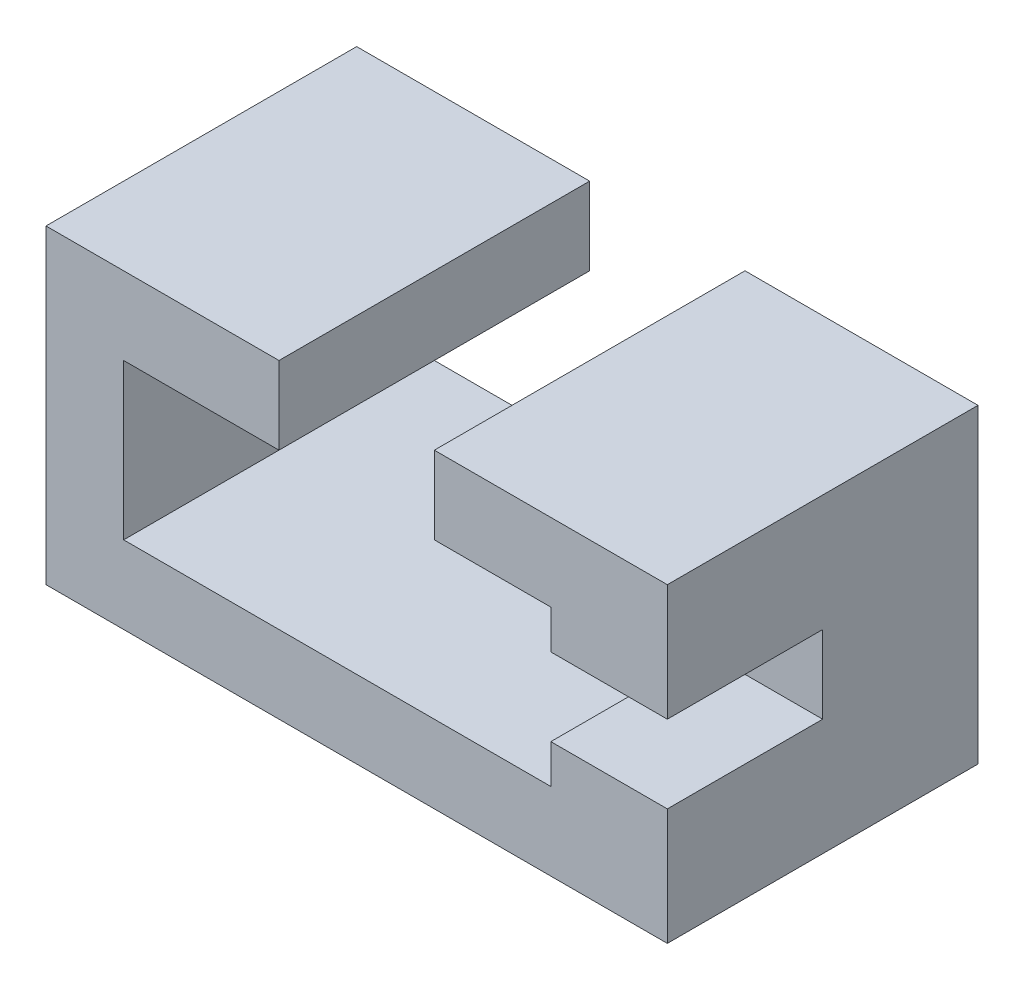
ISO-10303-21;
HEADER;
FILE_DESCRIPTION(('STEP AP214'),'2;1');
FILE_NAME('part.step','',(''),(''),'','','');
FILE_SCHEMA(('AUTOMOTIVE_DESIGN { 1 0 10303 214 1 1 1 1 }'));
ENDSEC;
DATA;
#1=APPLICATION_CONTEXT('core data for automotive mechanical design processes');
#2=APPLICATION_PROTOCOL_DEFINITION('international standard','automotive_design',2000,#1);
#3=PRODUCT_CONTEXT('',#1,'mechanical');
#4=PRODUCT('Part','Part','',(#3));
#5=PRODUCT_RELATED_PRODUCT_CATEGORY('part','',(#4));
#6=PRODUCT_DEFINITION_FORMATION('','',#4);
#7=PRODUCT_DEFINITION_CONTEXT('part definition',#1,'design');
#8=PRODUCT_DEFINITION('design','',#6,#7);
#9=PRODUCT_DEFINITION_SHAPE('','',#8);
#10=(LENGTH_UNIT() NAMED_UNIT(*) SI_UNIT(.MILLI.,.METRE.));
#11=(NAMED_UNIT(*) PLANE_ANGLE_UNIT() SI_UNIT($,.RADIAN.));
#12=(NAMED_UNIT(*) SI_UNIT($,.STERADIAN.) SOLID_ANGLE_UNIT());
#13=UNCERTAINTY_MEASURE_WITH_UNIT(LENGTH_MEASURE(1.E-05),#10,'distance_accuracy_value','');
#14=(GEOMETRIC_REPRESENTATION_CONTEXT(3) GLOBAL_UNCERTAINTY_ASSIGNED_CONTEXT((#13)) GLOBAL_UNIT_ASSIGNED_CONTEXT((#10,
#11,#12)) REPRESENTATION_CONTEXT('',''));
#15=CARTESIAN_POINT('',(0.,0.,0.));
#16=DIRECTION('',(0.,0.,1.));
#17=DIRECTION('',(1.,0.,0.));
#18=AXIS2_PLACEMENT_3D('',#15,#16,#17);
#19=CARTESIAN_POINT('',(-40.,20.,40.));
#20=DIRECTION('',(0.,-1.,0.));
#21=DIRECTION('',(0.,0.,-1.));
#22=AXIS2_PLACEMENT_3D('',#19,#20,#21);
#23=PLANE('',#22);
#24=DIRECTION('',(-1.,0.,0.));
#25=VECTOR('',#24,1.);
#26=CARTESIAN_POINT('',(-40.,20.,40.));
#27=LINE('',#26,#25);
#28=CARTESIAN_POINT('',(-10.,20.,40.));
#29=VERTEX_POINT('',#28);
#30=CARTESIAN_POINT('',(-40.,20.,40.));
#31=VERTEX_POINT('',#30);
#32=EDGE_CURVE('E204',#29,#31,#27,.T.);
#33=ORIENTED_EDGE('',*,*,#32,.F.);
#34=DIRECTION('',(0.,0.,1.));
#35=VECTOR('',#34,1.);
#36=CARTESIAN_POINT('',(-10.,20.,0.));
#37=LINE('',#36,#35);
#38=CARTESIAN_POINT('',(-10.,20.,0.));
#39=VERTEX_POINT('',#38);
#40=EDGE_CURVE('E251',#39,#29,#37,.T.);
#41=ORIENTED_EDGE('',*,*,#40,.F.);
#42=DIRECTION('',(-1.,0.,0.));
#43=VECTOR('',#42,1.);
#44=CARTESIAN_POINT('',(-40.,20.,0.));
#45=LINE('',#44,#43);
#46=CARTESIAN_POINT('',(-40.,20.,0.));
#47=VERTEX_POINT('',#46);
#48=EDGE_CURVE('E160',#39,#47,#45,.T.);
#49=ORIENTED_EDGE('',*,*,#48,.T.);
#50=DIRECTION('',(0.,0.,-1.));
#51=VECTOR('',#50,1.);
#52=CARTESIAN_POINT('',(-40.,20.,40.));
#53=LINE('',#52,#51);
#54=EDGE_CURVE('E41',#31,#47,#53,.T.);
#55=ORIENTED_EDGE('',*,*,#54,.F.);
#56=EDGE_LOOP('',(#33,#41,#49,#55));
#57=FACE_BOUND('',#56,.T.);
#58=ADVANCED_FACE('F33',(#57),#23,.F.);
#59=CARTESIAN_POINT('',(0.,0.,40.));
#60=DIRECTION('',(0.,0.,-1.));
#61=DIRECTION('',(-1.,0.,0.));
#62=AXIS2_PLACEMENT_3D('',#59,#60,#61);
#63=PLANE('',#62);
#64=DIRECTION('',(-1.,0.,0.));
#65=VECTOR('',#64,1.);
#66=CARTESIAN_POINT('',(-30.,10.,40.));
#67=LINE('',#66,#65);
#68=CARTESIAN_POINT('',(-10.,10.,40.));
#69=VERTEX_POINT('',#68);
#70=CARTESIAN_POINT('',(-30.,10.,40.));
#71=VERTEX_POINT('',#70);
#72=EDGE_CURVE('E187',#69,#71,#67,.T.);
#73=ORIENTED_EDGE('',*,*,#72,.F.);
#74=DIRECTION('',(0.,-1.,0.));
#75=VECTOR('',#74,1.);
#76=CARTESIAN_POINT('',(-10.,20.,40.));
#77=LINE('',#76,#75);
#78=EDGE_CURVE('E56',#29,#69,#77,.T.);
#79=ORIENTED_EDGE('',*,*,#78,.F.);
#80=ORIENTED_EDGE('',*,*,#32,.T.);
#81=DIRECTION('',(0.,-1.,0.));
#82=VECTOR('',#81,1.);
#83=CARTESIAN_POINT('',(-40.,-20.,40.));
#84=LINE('',#83,#82);
#85=CARTESIAN_POINT('',(-40.,-20.,40.));
#86=VERTEX_POINT('',#85);
#87=EDGE_CURVE('E209',#31,#86,#84,.T.);
#88=ORIENTED_EDGE('',*,*,#87,.T.);
#89=DIRECTION('',(1.,0.,0.));
#90=VECTOR('',#89,1.);
#91=CARTESIAN_POINT('',(-40.,-20.,40.));
#92=LINE('',#91,#90);
#93=CARTESIAN_POINT('',(40.,-20.,40.));
#94=VERTEX_POINT('',#93);
#95=EDGE_CURVE('E211',#86,#94,#92,.T.);
#96=ORIENTED_EDGE('',*,*,#95,.T.);
#97=DIRECTION('',(0.,1.,0.));
#98=VECTOR('',#97,1.);
#99=CARTESIAN_POINT('',(40.,-20.,40.));
#100=LINE('',#99,#98);
#101=CARTESIAN_POINT('',(40.,-5.,40.));
#102=VERTEX_POINT('',#101);
#103=EDGE_CURVE('E201',#94,#102,#100,.T.);
#104=ORIENTED_EDGE('',*,*,#103,.T.);
#105=DIRECTION('',(1.,0.,0.));
#106=VECTOR('',#105,1.);
#107=CARTESIAN_POINT('',(40.,-5.,40.));
#108=LINE('',#107,#106);
#109=CARTESIAN_POINT('',(25.,-5.,40.));
#110=VERTEX_POINT('',#109);
#111=EDGE_CURVE('E250',#110,#102,#108,.T.);
#112=ORIENTED_EDGE('',*,*,#111,.F.);
#113=DIRECTION('',(0.,1.,0.));
#114=VECTOR('',#113,1.);
#115=CARTESIAN_POINT('',(25.,10.,40.));
#116=LINE('',#115,#114);
#117=CARTESIAN_POINT('',(25.,-10.,40.));
#118=VERTEX_POINT('',#117);
#119=EDGE_CURVE('E184',#118,#110,#116,.T.);
#120=ORIENTED_EDGE('',*,*,#119,.F.);
#121=DIRECTION('',(1.,0.,0.));
#122=VECTOR('',#121,1.);
#123=CARTESIAN_POINT('',(-30.,-10.,40.));
#124=LINE('',#123,#122);
#125=CARTESIAN_POINT('',(-30.,-10.,40.));
#126=VERTEX_POINT('',#125);
#127=EDGE_CURVE('E179',#126,#118,#124,.T.);
#128=ORIENTED_EDGE('',*,*,#127,.F.);
#129=DIRECTION('',(0.,-1.,0.));
#130=VECTOR('',#129,1.);
#131=CARTESIAN_POINT('',(-30.,10.,40.));
#132=LINE('',#131,#130);
#133=EDGE_CURVE('E177',#71,#126,#132,.T.);
#134=ORIENTED_EDGE('',*,*,#133,.F.);
#135=EDGE_LOOP('',(#73,#79,#80,#88,#96,#104,#112,#120,#128,#134));
#136=FACE_BOUND('',#135,.T.);
#137=ADVANCED_FACE('F248',(#136),#63,.F.);
#138=CARTESIAN_POINT('',(-30.,10.,0.));
#139=DIRECTION('',(0.,1.,0.));
#140=DIRECTION('',(0.,0.,1.));
#141=AXIS2_PLACEMENT_3D('',#138,#139,#140);
#142=PLANE('',#141);
#143=DIRECTION('',(-1.,0.,0.));
#144=VECTOR('',#143,1.);
#145=CARTESIAN_POINT('',(-30.,10.,0.));
#146=LINE('',#145,#144);
#147=CARTESIAN_POINT('',(-10.,10.,0.));
#148=VERTEX_POINT('',#147);
#149=CARTESIAN_POINT('',(-30.,10.,0.));
#150=VERTEX_POINT('',#149);
#151=EDGE_CURVE('E157',#148,#150,#146,.T.);
#152=ORIENTED_EDGE('',*,*,#151,.F.);
#153=DIRECTION('',(0.,0.,1.));
#154=VECTOR('',#153,1.);
#155=CARTESIAN_POINT('',(-10.,10.,0.));
#156=LINE('',#155,#154);
#157=EDGE_CURVE('E143',#148,#69,#156,.T.);
#158=ORIENTED_EDGE('',*,*,#157,.T.);
#159=ORIENTED_EDGE('',*,*,#72,.T.);
#160=DIRECTION('',(0.,0.,1.));
#161=VECTOR('',#160,1.);
#162=CARTESIAN_POINT('',(-30.,10.,0.));
#163=LINE('',#162,#161);
#164=EDGE_CURVE('E165',#150,#71,#163,.T.);
#165=ORIENTED_EDGE('',*,*,#164,.F.);
#166=EDGE_LOOP('',(#152,#158,#159,#165));
#167=FACE_BOUND('',#166,.T.);
#168=ADVANCED_FACE('F163',(#167),#142,.F.);
#169=CARTESIAN_POINT('',(40.,-20.,40.));
#170=DIRECTION('',(-1.,0.,0.));
#171=DIRECTION('',(0.,0.,1.));
#172=AXIS2_PLACEMENT_3D('',#169,#170,#171);
#173=PLANE('',#172);
#174=DIRECTION('',(0.,1.,0.));
#175=VECTOR('',#174,1.);
#176=CARTESIAN_POINT('',(40.,-5.,20.));
#177=LINE('',#176,#175);
#178=CARTESIAN_POINT('',(40.,-5.,20.));
#179=VERTEX_POINT('',#178);
#180=CARTESIAN_POINT('',(40.,5.,20.));
#181=VERTEX_POINT('',#180);
#182=EDGE_CURVE('E262',#179,#181,#177,.T.);
#183=ORIENTED_EDGE('',*,*,#182,.F.);
#184=DIRECTION('',(0.,0.,1.));
#185=VECTOR('',#184,1.);
#186=CARTESIAN_POINT('',(40.,-5.,20.));
#187=LINE('',#186,#185);
#188=EDGE_CURVE('E180',#179,#102,#187,.T.);
#189=ORIENTED_EDGE('',*,*,#188,.T.);
#190=ORIENTED_EDGE('',*,*,#103,.F.);
#191=DIRECTION('',(0.,0.,-1.));
#192=VECTOR('',#191,1.);
#193=CARTESIAN_POINT('',(40.,-20.,40.));
#194=LINE('',#193,#192);
#195=CARTESIAN_POINT('',(40.,-20.,0.));
#196=VERTEX_POINT('',#195);
#197=EDGE_CURVE('E213',#94,#196,#194,.T.);
#198=ORIENTED_EDGE('',*,*,#197,.T.);
#199=DIRECTION('',(0.,1.,0.));
#200=VECTOR('',#199,1.);
#201=CARTESIAN_POINT('',(40.,-20.,0.));
#202=LINE('',#201,#200);
#203=CARTESIAN_POINT('',(40.,20.,0.));
#204=VERTEX_POINT('',#203);
#205=EDGE_CURVE('E193',#196,#204,#202,.T.);
#206=ORIENTED_EDGE('',*,*,#205,.T.);
#207=DIRECTION('',(0.,0.,-1.));
#208=VECTOR('',#207,1.);
#209=CARTESIAN_POINT('',(40.,20.,40.));
#210=LINE('',#209,#208);
#211=CARTESIAN_POINT('',(40.,20.,40.));
#212=VERTEX_POINT('',#211);
#213=EDGE_CURVE('E11',#212,#204,#210,.T.);
#214=ORIENTED_EDGE('',*,*,#213,.F.);
#215=CARTESIAN_POINT('',(40.,5.,40.));
#216=VERTEX_POINT('',#215);
#217=EDGE_CURVE('E205',#216,#212,#100,.T.);
#218=ORIENTED_EDGE('',*,*,#217,.F.);
#219=DIRECTION('',(0.,0.,1.));
#220=VECTOR('',#219,1.);
#221=CARTESIAN_POINT('',(40.,5.,20.));
#222=LINE('',#221,#220);
#223=EDGE_CURVE('E271',#181,#216,#222,.T.);
#224=ORIENTED_EDGE('',*,*,#223,.F.);
#225=EDGE_LOOP('',(#183,#189,#190,#198,#206,#214,#218,#224));
#226=FACE_BOUND('',#225,.T.);
#227=ADVANCED_FACE('F35',(#226),#173,.F.);
#228=CARTESIAN_POINT('',(9.99999999999999,20.,0.));
#229=VERTEX_POINT('',#228);
#230=EDGE_CURVE('E216',#204,#229,#45,.T.);
#231=ORIENTED_EDGE('',*,*,#230,.T.);
#232=DIRECTION('',(0.,0.,1.));
#233=VECTOR('',#232,1.);
#234=CARTESIAN_POINT('',(9.99999999999999,20.,0.));
#235=LINE('',#234,#233);
#236=CARTESIAN_POINT('',(9.99999999999999,20.,40.));
#237=VERTEX_POINT('',#236);
#238=EDGE_CURVE('E253',#229,#237,#235,.T.);
#239=ORIENTED_EDGE('',*,*,#238,.T.);
#240=EDGE_CURVE('E206',#212,#237,#27,.T.);
#241=ORIENTED_EDGE('',*,*,#240,.F.);
#242=ORIENTED_EDGE('',*,*,#213,.T.);
#243=EDGE_LOOP('',(#231,#239,#241,#242));
#244=FACE_BOUND('',#243,.T.);
#245=ADVANCED_FACE('F297',(#244),#23,.F.);
#246=CARTESIAN_POINT('',(-40.,-20.,40.));
#247=DIRECTION('',(1.,0.,0.));
#248=DIRECTION('',(0.,0.,-1.));
#249=AXIS2_PLACEMENT_3D('',#246,#247,#248);
#250=PLANE('',#249);
#251=DIRECTION('',(0.,-1.,0.));
#252=VECTOR('',#251,1.);
#253=CARTESIAN_POINT('',(-40.,-20.,0.));
#254=LINE('',#253,#252);
#255=CARTESIAN_POINT('',(-40.,-20.,0.));
#256=VERTEX_POINT('',#255);
#257=EDGE_CURVE('E219',#47,#256,#254,.T.);
#258=ORIENTED_EDGE('',*,*,#257,.T.);
#259=DIRECTION('',(0.,0.,-1.));
#260=VECTOR('',#259,1.);
#261=CARTESIAN_POINT('',(-40.,-20.,40.));
#262=LINE('',#261,#260);
#263=EDGE_CURVE('E225',#86,#256,#262,.T.);
#264=ORIENTED_EDGE('',*,*,#263,.F.);
#265=ORIENTED_EDGE('',*,*,#87,.F.);
#266=ORIENTED_EDGE('',*,*,#54,.T.);
#267=EDGE_LOOP('',(#258,#264,#265,#266));
#268=FACE_BOUND('',#267,.T.);
#269=ADVANCED_FACE('F231',(#268),#250,.F.);
#270=CARTESIAN_POINT('',(-40.,-20.,40.));
#271=DIRECTION('',(0.,1.,0.));
#272=DIRECTION('',(0.,0.,1.));
#273=AXIS2_PLACEMENT_3D('',#270,#271,#272);
#274=PLANE('',#273);
#275=DIRECTION('',(1.,0.,0.));
#276=VECTOR('',#275,1.);
#277=CARTESIAN_POINT('',(-40.,-20.,0.));
#278=LINE('',#277,#276);
#279=EDGE_CURVE('E221',#256,#196,#278,.T.);
#280=ORIENTED_EDGE('',*,*,#279,.T.);
#281=ORIENTED_EDGE('',*,*,#197,.F.);
#282=ORIENTED_EDGE('',*,*,#95,.F.);
#283=ORIENTED_EDGE('',*,*,#263,.T.);
#284=EDGE_LOOP('',(#280,#281,#282,#283));
#285=FACE_BOUND('',#284,.T.);
#286=ADVANCED_FACE('F239',(#285),#274,.F.);
#287=ORIENTED_EDGE('',*,*,#240,.T.);
#288=DIRECTION('',(0.,1.,0.));
#289=VECTOR('',#288,1.);
#290=CARTESIAN_POINT('',(9.99999999999999,20.,40.));
#291=LINE('',#290,#289);
#292=CARTESIAN_POINT('',(9.99999999999999,10.,40.));
#293=VERTEX_POINT('',#292);
#294=EDGE_CURVE('E161',#293,#237,#291,.T.);
#295=ORIENTED_EDGE('',*,*,#294,.F.);
#296=CARTESIAN_POINT('',(25.,10.,40.));
#297=VERTEX_POINT('',#296);
#298=EDGE_CURVE('E188',#297,#293,#67,.T.);
#299=ORIENTED_EDGE('',*,*,#298,.F.);
#300=CARTESIAN_POINT('',(25.,5.,40.));
#301=VERTEX_POINT('',#300);
#302=EDGE_CURVE('E183',#301,#297,#116,.T.);
#303=ORIENTED_EDGE('',*,*,#302,.F.);
#304=DIRECTION('',(-1.,0.,0.));
#305=VECTOR('',#304,1.);
#306=CARTESIAN_POINT('',(40.,5.,40.));
#307=LINE('',#306,#305);
#308=EDGE_CURVE('E252',#216,#301,#307,.T.);
#309=ORIENTED_EDGE('',*,*,#308,.F.);
#310=ORIENTED_EDGE('',*,*,#217,.T.);
#311=EDGE_LOOP('',(#287,#295,#299,#303,#309,#310));
#312=FACE_BOUND('',#311,.T.);
#313=ADVANCED_FACE('F303',(#312),#63,.F.);
#314=CARTESIAN_POINT('',(0.,0.,0.));
#315=DIRECTION('',(0.,0.,-1.));
#316=DIRECTION('',(-1.,0.,0.));
#317=AXIS2_PLACEMENT_3D('',#314,#315,#316);
#318=PLANE('',#317);
#319=DIRECTION('',(0.,-1.,0.));
#320=VECTOR('',#319,1.);
#321=CARTESIAN_POINT('',(-10.,20.,0.));
#322=LINE('',#321,#320);
#323=EDGE_CURVE('E146',#39,#148,#322,.T.);
#324=ORIENTED_EDGE('',*,*,#323,.T.);
#325=ORIENTED_EDGE('',*,*,#151,.T.);
#326=DIRECTION('',(0.,-1.,0.));
#327=VECTOR('',#326,1.);
#328=CARTESIAN_POINT('',(-30.,10.,0.));
#329=LINE('',#328,#327);
#330=CARTESIAN_POINT('',(-30.,-10.,0.));
#331=VERTEX_POINT('',#330);
#332=EDGE_CURVE('E191',#150,#331,#329,.T.);
#333=ORIENTED_EDGE('',*,*,#332,.T.);
#334=DIRECTION('',(1.,0.,0.));
#335=VECTOR('',#334,1.);
#336=CARTESIAN_POINT('',(-30.,-10.,0.));
#337=LINE('',#336,#335);
#338=CARTESIAN_POINT('',(25.,-10.,0.));
#339=VERTEX_POINT('',#338);
#340=EDGE_CURVE('E173',#331,#339,#337,.T.);
#341=ORIENTED_EDGE('',*,*,#340,.T.);
#342=DIRECTION('',(0.,1.,0.));
#343=VECTOR('',#342,1.);
#344=CARTESIAN_POINT('',(25.,10.,0.));
#345=LINE('',#344,#343);
#346=CARTESIAN_POINT('',(25.,10.,0.));
#347=VERTEX_POINT('',#346);
#348=EDGE_CURVE('E168',#339,#347,#345,.T.);
#349=ORIENTED_EDGE('',*,*,#348,.T.);
#350=CARTESIAN_POINT('',(9.99999999999999,10.,0.));
#351=VERTEX_POINT('',#350);
#352=EDGE_CURVE('E167',#347,#351,#146,.T.);
#353=ORIENTED_EDGE('',*,*,#352,.T.);
#354=DIRECTION('',(0.,1.,0.));
#355=VECTOR('',#354,1.);
#356=CARTESIAN_POINT('',(9.99999999999999,20.,0.));
#357=LINE('',#356,#355);
#358=EDGE_CURVE('E48',#351,#229,#357,.T.);
#359=ORIENTED_EDGE('',*,*,#358,.T.);
#360=ORIENTED_EDGE('',*,*,#230,.F.);
#361=ORIENTED_EDGE('',*,*,#205,.F.);
#362=ORIENTED_EDGE('',*,*,#279,.F.);
#363=ORIENTED_EDGE('',*,*,#257,.F.);
#364=ORIENTED_EDGE('',*,*,#48,.F.);
#365=EDGE_LOOP('',(#324,#325,#333,#341,#349,#353,#359,#360,#361,#362,#363,#364));
#366=FACE_BOUND('',#365,.T.);
#367=ADVANCED_FACE('F155',(#366),#318,.T.);
#368=CARTESIAN_POINT('',(-30.,10.,0.));
#369=DIRECTION('',(-1.,0.,0.));
#370=DIRECTION('',(0.,-1.,0.));
#371=AXIS2_PLACEMENT_3D('',#368,#369,#370);
#372=PLANE('',#371);
#373=ORIENTED_EDGE('',*,*,#133,.T.);
#374=DIRECTION('',(0.,0.,1.));
#375=VECTOR('',#374,1.);
#376=CARTESIAN_POINT('',(-30.,-10.,0.));
#377=LINE('',#376,#375);
#378=EDGE_CURVE('E171',#331,#126,#377,.T.);
#379=ORIENTED_EDGE('',*,*,#378,.F.);
#380=ORIENTED_EDGE('',*,*,#332,.F.);
#381=ORIENTED_EDGE('',*,*,#164,.T.);
#382=EDGE_LOOP('',(#373,#379,#380,#381));
#383=FACE_BOUND('',#382,.T.);
#384=ADVANCED_FACE('F347',(#383),#372,.F.);
#385=ORIENTED_EDGE('',*,*,#298,.T.);
#386=DIRECTION('',(0.,0.,1.));
#387=VECTOR('',#386,1.);
#388=CARTESIAN_POINT('',(9.99999999999999,10.,0.));
#389=LINE('',#388,#387);
#390=EDGE_CURVE('E151',#351,#293,#389,.T.);
#391=ORIENTED_EDGE('',*,*,#390,.F.);
#392=ORIENTED_EDGE('',*,*,#352,.F.);
#393=DIRECTION('',(0.,0.,1.));
#394=VECTOR('',#393,1.);
#395=CARTESIAN_POINT('',(25.,10.,0.));
#396=LINE('',#395,#394);
#397=EDGE_CURVE('E194',#347,#297,#396,.T.);
#398=ORIENTED_EDGE('',*,*,#397,.T.);
#399=EDGE_LOOP('',(#385,#391,#392,#398));
#400=FACE_BOUND('',#399,.T.);
#401=ADVANCED_FACE('F294',(#400),#142,.F.);
#402=CARTESIAN_POINT('',(25.,10.,0.));
#403=DIRECTION('',(1.,0.,0.));
#404=DIRECTION('',(0.,1.,0.));
#405=AXIS2_PLACEMENT_3D('',#402,#403,#404);
#406=PLANE('',#405);
#407=ORIENTED_EDGE('',*,*,#119,.T.);
#408=DIRECTION('',(0.,0.,1.));
#409=VECTOR('',#408,1.);
#410=CARTESIAN_POINT('',(25.,-5.,20.));
#411=LINE('',#410,#409);
#412=CARTESIAN_POINT('',(25.,-5.,20.));
#413=VERTEX_POINT('',#412);
#414=EDGE_CURVE('E275',#413,#110,#411,.T.);
#415=ORIENTED_EDGE('',*,*,#414,.F.);
#416=DIRECTION('',(0.,-1.,0.));
#417=VECTOR('',#416,1.);
#418=CARTESIAN_POINT('',(25.,-5.,20.));
#419=LINE('',#418,#417);
#420=CARTESIAN_POINT('',(25.,5.,20.));
#421=VERTEX_POINT('',#420);
#422=EDGE_CURVE('E267',#421,#413,#419,.T.);
#423=ORIENTED_EDGE('',*,*,#422,.F.);
#424=DIRECTION('',(0.,0.,1.));
#425=VECTOR('',#424,1.);
#426=CARTESIAN_POINT('',(25.,5.,20.));
#427=LINE('',#426,#425);
#428=EDGE_CURVE('E277',#421,#301,#427,.T.);
#429=ORIENTED_EDGE('',*,*,#428,.T.);
#430=ORIENTED_EDGE('',*,*,#302,.T.);
#431=ORIENTED_EDGE('',*,*,#397,.F.);
#432=ORIENTED_EDGE('',*,*,#348,.F.);
#433=DIRECTION('',(0.,0.,1.));
#434=VECTOR('',#433,1.);
#435=CARTESIAN_POINT('',(25.,-10.,0.));
#436=LINE('',#435,#434);
#437=EDGE_CURVE('E197',#339,#118,#436,.T.);
#438=ORIENTED_EDGE('',*,*,#437,.T.);
#439=EDGE_LOOP('',(#407,#415,#423,#429,#430,#431,#432,#438));
#440=FACE_BOUND('',#439,.T.);
#441=ADVANCED_FACE('F288',(#440),#406,.F.);
#442=CARTESIAN_POINT('',(-30.,-10.,0.));
#443=DIRECTION('',(0.,-1.,0.));
#444=DIRECTION('',(0.,0.,-1.));
#445=AXIS2_PLACEMENT_3D('',#442,#443,#444);
#446=PLANE('',#445);
#447=ORIENTED_EDGE('',*,*,#127,.T.);
#448=ORIENTED_EDGE('',*,*,#437,.F.);
#449=ORIENTED_EDGE('',*,*,#340,.F.);
#450=ORIENTED_EDGE('',*,*,#378,.T.);
#451=EDGE_LOOP('',(#447,#448,#449,#450));
#452=FACE_BOUND('',#451,.T.);
#453=ADVANCED_FACE('F285',(#452),#446,.F.);
#454=CARTESIAN_POINT('',(40.,-5.,20.));
#455=DIRECTION('',(0.,-1.,0.));
#456=DIRECTION('',(0.,0.,-1.));
#457=AXIS2_PLACEMENT_3D('',#454,#455,#456);
#458=PLANE('',#457);
#459=ORIENTED_EDGE('',*,*,#111,.T.);
#460=ORIENTED_EDGE('',*,*,#188,.F.);
#461=DIRECTION('',(1.,0.,0.));
#462=VECTOR('',#461,1.);
#463=CARTESIAN_POINT('',(40.,-5.,20.));
#464=LINE('',#463,#462);
#465=EDGE_CURVE('E269',#413,#179,#464,.T.);
#466=ORIENTED_EDGE('',*,*,#465,.F.);
#467=ORIENTED_EDGE('',*,*,#414,.T.);
#468=EDGE_LOOP('',(#459,#460,#466,#467));
#469=FACE_BOUND('',#468,.T.);
#470=ADVANCED_FACE('F313',(#469),#458,.F.);
#471=CARTESIAN_POINT('',(40.,5.,20.));
#472=DIRECTION('',(0.,1.,0.));
#473=DIRECTION('',(-1.,0.,0.));
#474=AXIS2_PLACEMENT_3D('',#471,#472,#473);
#475=PLANE('',#474);
#476=ORIENTED_EDGE('',*,*,#308,.T.);
#477=ORIENTED_EDGE('',*,*,#428,.F.);
#478=DIRECTION('',(-1.,0.,0.));
#479=VECTOR('',#478,1.);
#480=CARTESIAN_POINT('',(40.,5.,20.));
#481=LINE('',#480,#479);
#482=EDGE_CURVE('E265',#181,#421,#481,.T.);
#483=ORIENTED_EDGE('',*,*,#482,.F.);
#484=ORIENTED_EDGE('',*,*,#223,.T.);
#485=EDGE_LOOP('',(#476,#477,#483,#484));
#486=FACE_BOUND('',#485,.T.);
#487=ADVANCED_FACE('F307',(#486),#475,.F.);
#488=CARTESIAN_POINT('',(0.,0.,20.));
#489=DIRECTION('',(0.,0.,1.));
#490=DIRECTION('',(1.,0.,0.));
#491=AXIS2_PLACEMENT_3D('',#488,#489,#490);
#492=PLANE('',#491);
#493=ORIENTED_EDGE('',*,*,#182,.T.);
#494=ORIENTED_EDGE('',*,*,#482,.T.);
#495=ORIENTED_EDGE('',*,*,#422,.T.);
#496=ORIENTED_EDGE('',*,*,#465,.T.);
#497=EDGE_LOOP('',(#493,#494,#495,#496));
#498=FACE_BOUND('',#497,.T.);
#499=ADVANCED_FACE('F311',(#498),#492,.T.);
#500=CARTESIAN_POINT('',(9.99999999999999,20.,0.));
#501=DIRECTION('',(1.,0.,0.));
#502=DIRECTION('',(0.,0.,-1.));
#503=AXIS2_PLACEMENT_3D('',#500,#501,#502);
#504=PLANE('',#503);
#505=ORIENTED_EDGE('',*,*,#294,.T.);
#506=ORIENTED_EDGE('',*,*,#238,.F.);
#507=ORIENTED_EDGE('',*,*,#358,.F.);
#508=ORIENTED_EDGE('',*,*,#390,.T.);
#509=EDGE_LOOP('',(#505,#506,#507,#508));
#510=FACE_BOUND('',#509,.T.);
#511=ADVANCED_FACE('F408',(#510),#504,.F.);
#512=CARTESIAN_POINT('',(-10.,20.,0.));
#513=DIRECTION('',(-1.,0.,0.));
#514=DIRECTION('',(0.,0.,1.));
#515=AXIS2_PLACEMENT_3D('',#512,#513,#514);
#516=PLANE('',#515);
#517=ORIENTED_EDGE('',*,*,#78,.T.);
#518=ORIENTED_EDGE('',*,*,#157,.F.);
#519=ORIENTED_EDGE('',*,*,#323,.F.);
#520=ORIENTED_EDGE('',*,*,#40,.T.);
#521=EDGE_LOOP('',(#517,#518,#519,#520));
#522=FACE_BOUND('',#521,.T.);
#523=ADVANCED_FACE('F145',(#522),#516,.F.);
#524=CLOSED_SHELL('',(#58,#137,#168,#227,#245,#269,#286,#313,#367,#384,#401,#441,#453,#470,#487,
#499,#511,#523));
#525=MANIFOLD_SOLID_BREP('B2',#524);
#526=ADVANCED_BREP_SHAPE_REPRESENTATION('',(#18,#525),#14);
#527=SHAPE_DEFINITION_REPRESENTATION(#9,#526);
ENDSEC;
END-ISO-10303-21;
